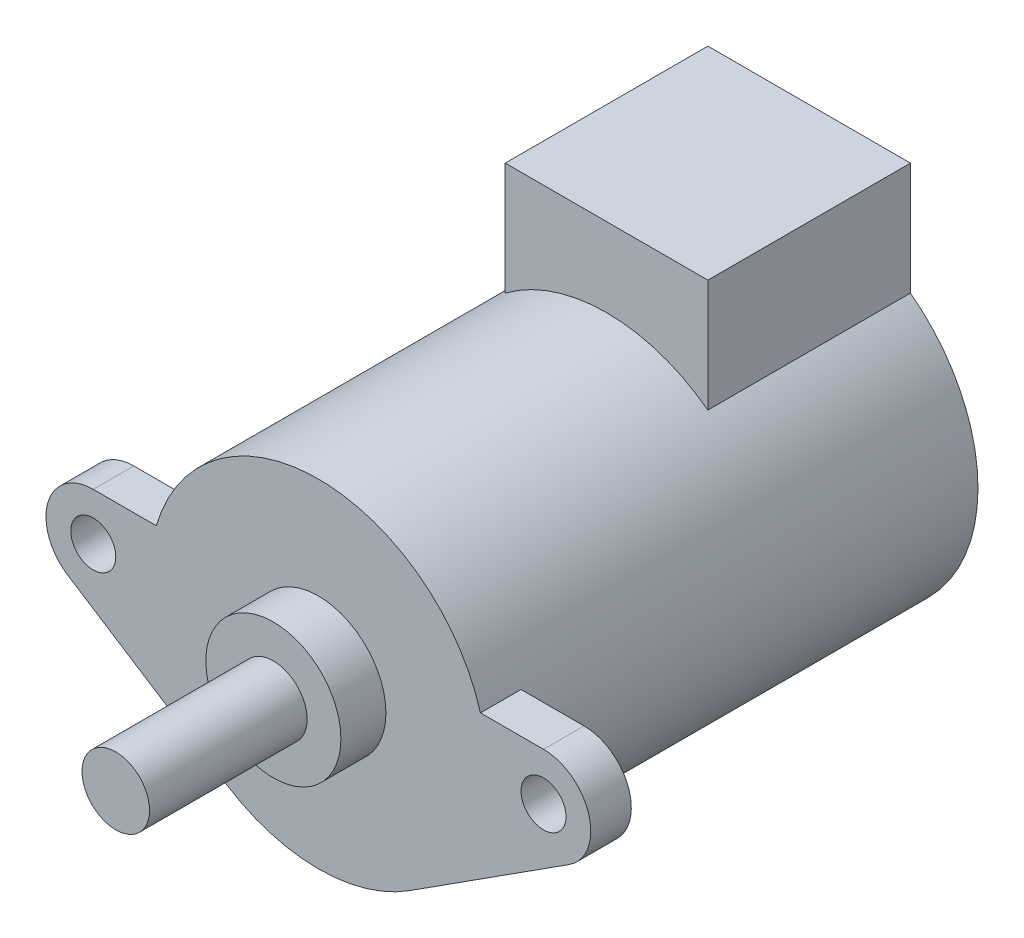
ISO-10303-21;
HEADER;
FILE_DESCRIPTION(('STEP AP214'),'2;1');
FILE_NAME('part.step','',(''),(''),'','','');
FILE_SCHEMA(('AUTOMOTIVE_DESIGN { 1 0 10303 214 1 1 1 1 }'));
ENDSEC;
DATA;
#1=APPLICATION_CONTEXT('core data for automotive mechanical design processes');
#2=APPLICATION_PROTOCOL_DEFINITION('international standard','automotive_design',2000,#1);
#3=PRODUCT_CONTEXT('',#1,'mechanical');
#4=PRODUCT('Part','Part','',(#3));
#5=PRODUCT_RELATED_PRODUCT_CATEGORY('part','',(#4));
#6=PRODUCT_DEFINITION_FORMATION('','',#4);
#7=PRODUCT_DEFINITION_CONTEXT('part definition',#1,'design');
#8=PRODUCT_DEFINITION('design','',#6,#7);
#9=PRODUCT_DEFINITION_SHAPE('','',#8);
#10=(LENGTH_UNIT() NAMED_UNIT(*) SI_UNIT(.MILLI.,.METRE.));
#11=(NAMED_UNIT(*) PLANE_ANGLE_UNIT() SI_UNIT($,.RADIAN.));
#12=(NAMED_UNIT(*) SI_UNIT($,.STERADIAN.) SOLID_ANGLE_UNIT());
#13=UNCERTAINTY_MEASURE_WITH_UNIT(LENGTH_MEASURE(1.E-05),#10,'distance_accuracy_value','');
#14=(GEOMETRIC_REPRESENTATION_CONTEXT(3) GLOBAL_UNCERTAINTY_ASSIGNED_CONTEXT((#13)) GLOBAL_UNIT_ASSIGNED_CONTEXT((#10,
#11,#12)) REPRESENTATION_CONTEXT('',''));
#15=CARTESIAN_POINT('',(0.,0.,0.));
#16=DIRECTION('',(0.,0.,1.));
#17=DIRECTION('',(1.,0.,0.));
#18=AXIS2_PLACEMENT_3D('',#15,#16,#17);
#19=CARTESIAN_POINT('',(7.5,0.,-20.));
#20=DIRECTION('',(0.,0.,-1.));
#21=DIRECTION('',(-1.,0.,0.));
#22=AXIS2_PLACEMENT_3D('',#19,#20,#21);
#23=PLANE('',#22);
#24=CARTESIAN_POINT('',(0.,0.,-20.));
#25=DIRECTION('',(0.,0.,1.));
#26=DIRECTION('',(1.,0.,0.));
#27=AXIS2_PLACEMENT_3D('',#24,#25,#26);
#28=CIRCLE('',#27,7.5);
#29=CARTESIAN_POINT('',(-4.5,5.99999999997181,-20.));
#30=VERTEX_POINT('',#29);
#31=CARTESIAN_POINT('',(4.5,6.,-20.));
#32=VERTEX_POINT('',#31);
#33=EDGE_CURVE('E11',#30,#32,#28,.T.);
#34=ORIENTED_EDGE('',*,*,#33,.F.);
#35=DIRECTION('',(0.,1.,0.));
#36=VECTOR('',#35,1.);
#37=CARTESIAN_POINT('',(-4.5,-500000.,-20.));
#38=LINE('',#37,#36);
#39=CARTESIAN_POINT('',(-4.5,11.,-20.));
#40=VERTEX_POINT('',#39);
#41=EDGE_CURVE('E122',#30,#40,#38,.T.);
#42=ORIENTED_EDGE('',*,*,#41,.T.);
#43=DIRECTION('',(-1.,0.,0.));
#44=VECTOR('',#43,1.);
#45=CARTESIAN_POINT('',(4.5,11.,-20.));
#46=LINE('',#45,#44);
#47=CARTESIAN_POINT('',(4.5,11.,-20.));
#48=VERTEX_POINT('',#47);
#49=EDGE_CURVE('E283',#48,#40,#46,.T.);
#50=ORIENTED_EDGE('',*,*,#49,.F.);
#51=DIRECTION('',(0.,1.,0.));
#52=VECTOR('',#51,1.);
#53=CARTESIAN_POINT('',(4.5,-500000.,-20.));
#54=LINE('',#53,#52);
#55=EDGE_CURVE('E124',#32,#48,#54,.T.);
#56=ORIENTED_EDGE('',*,*,#55,.F.);
#57=EDGE_LOOP('',(#34,#42,#50,#56));
#58=FACE_BOUND('',#57,.T.);
#59=CARTESIAN_POINT('',(0.,0.,-20.));
#60=DIRECTION('',(0.,0.,-1.));
#61=DIRECTION('',(-1.,0.,0.));
#62=AXIS2_PLACEMENT_3D('',#59,#60,#61);
#63=CIRCLE('',#62,1.);
#64=CARTESIAN_POINT('',(-1.,0.,-20.));
#65=VERTEX_POINT('',#64);
#66=EDGE_CURVE('E268',#65,#65,#63,.T.);
#67=ORIENTED_EDGE('',*,*,#66,.F.);
#68=EDGE_LOOP('',(#67));
#69=FACE_BOUND('',#68,.T.);
#70=ADVANCED_FACE('F33',(#58,#69),#23,.T.);
#71=CARTESIAN_POINT('',(0.,0.,3.8));
#72=DIRECTION('',(0.,0.,1.));
#73=DIRECTION('',(1.,0.,0.));
#74=AXIS2_PLACEMENT_3D('',#71,#72,#73);
#75=PLANE('',#74);
#76=CARTESIAN_POINT('',(0.,0.,3.8));
#77=DIRECTION('',(0.,0.,1.));
#78=DIRECTION('',(1.,0.,0.));
#79=AXIS2_PLACEMENT_3D('',#76,#77,#78);
#80=CIRCLE('',#79,3.);
#81=CARTESIAN_POINT('',(3.,0.,3.8));
#82=VERTEX_POINT('',#81);
#83=EDGE_CURVE('E152',#82,#82,#80,.T.);
#84=ORIENTED_EDGE('',*,*,#83,.T.);
#85=EDGE_LOOP('',(#84));
#86=FACE_BOUND('',#85,.T.);
#87=CARTESIAN_POINT('',(0.,0.,3.8));
#88=DIRECTION('',(0.,0.,1.));
#89=DIRECTION('',(1.,0.,0.));
#90=AXIS2_PLACEMENT_3D('',#87,#88,#89);
#91=CIRCLE('',#90,1.5);
#92=CARTESIAN_POINT('',(1.5,0.,3.8));
#93=VERTEX_POINT('',#92);
#94=EDGE_CURVE('E148',#93,#93,#91,.T.);
#95=ORIENTED_EDGE('',*,*,#94,.F.);
#96=EDGE_LOOP('',(#95));
#97=FACE_BOUND('',#96,.T.);
#98=ADVANCED_FACE('F250',(#86,#97),#75,.T.);
#99=CARTESIAN_POINT('',(0.,0.,1.8));
#100=DIRECTION('',(0.,0.,1.));
#101=DIRECTION('',(1.,0.,0.));
#102=AXIS2_PLACEMENT_3D('',#99,#100,#101);
#103=PLANE('',#102);
#104=CARTESIAN_POINT('',(-10.,0.,1.8));
#105=DIRECTION('',(0.,0.,1.));
#106=DIRECTION('',(1.,0.,0.));
#107=AXIS2_PLACEMENT_3D('',#104,#105,#106);
#108=CIRCLE('',#107,1.00000000000001);
#109=CARTESIAN_POINT('',(-8.99999999999999,0.,1.8));
#110=VERTEX_POINT('',#109);
#111=EDGE_CURVE('E263',#110,#110,#108,.T.);
#112=ORIENTED_EDGE('',*,*,#111,.F.);
#113=EDGE_LOOP('',(#112));
#114=FACE_BOUND('',#113,.T.);
#115=CARTESIAN_POINT('',(10.,0.,1.8));
#116=DIRECTION('',(0.,0.,1.));
#117=DIRECTION('',(1.,0.,0.));
#118=AXIS2_PLACEMENT_3D('',#115,#116,#117);
#119=CIRCLE('',#118,1.00000000000001);
#120=CARTESIAN_POINT('',(11.,0.,1.8));
#121=VERTEX_POINT('',#120);
#122=EDGE_CURVE('E266',#121,#121,#119,.T.);
#123=ORIENTED_EDGE('',*,*,#122,.F.);
#124=EDGE_LOOP('',(#123));
#125=FACE_BOUND('',#124,.T.);
#126=CARTESIAN_POINT('',(0.,0.,1.8));
#127=DIRECTION('',(0.,0.,1.));
#128=DIRECTION('',(1.,0.,0.));
#129=AXIS2_PLACEMENT_3D('',#126,#127,#128);
#130=CIRCLE('',#129,7.5);
#131=CARTESIAN_POINT('',(-4.04999999999986,-6.31248762375017,1.8));
#132=VERTEX_POINT('',#131);
#133=CARTESIAN_POINT('',(4.05000000000006,-6.31248762375009,1.8));
#134=VERTEX_POINT('',#133);
#135=EDGE_CURVE('E41',#132,#134,#130,.T.);
#136=ORIENTED_EDGE('',*,*,#135,.T.);
#137=DIRECTION('',(0.841665016500016,0.540000000000025,0.));
#138=VECTOR('',#137,1.);
#139=CARTESIAN_POINT('',(4.05000000000006,-6.31248762375009,1.8));
#140=LINE('',#139,#138);
#141=CARTESIAN_POINT('',(11.1339999999998,-1.76749653464975,1.8));
#142=VERTEX_POINT('',#141);
#143=EDGE_CURVE('E162',#134,#142,#140,.T.);
#144=ORIENTED_EDGE('',*,*,#143,.T.);
#145=CARTESIAN_POINT('',(10.,0.,1.8));
#146=DIRECTION('',(0.,0.,1.));
#147=DIRECTION('',(1.,0.,0.));
#148=AXIS2_PLACEMENT_3D('',#145,#146,#147);
#149=CIRCLE('',#148,2.09999999999982);
#150=CARTESIAN_POINT('',(10.,2.1,1.8));
#151=VERTEX_POINT('',#150);
#152=EDGE_CURVE('E155',#142,#151,#149,.T.);
#153=ORIENTED_EDGE('',*,*,#152,.T.);
#154=DIRECTION('',(-1.,0.,0.));
#155=VECTOR('',#154,1.);
#156=CARTESIAN_POINT('',(10.,2.1,1.8));
#157=LINE('',#156,#155);
#158=CARTESIAN_POINT('',(7.2,2.1,1.8));
#159=VERTEX_POINT('',#158);
#160=EDGE_CURVE('E174',#151,#159,#157,.T.);
#161=ORIENTED_EDGE('',*,*,#160,.T.);
#162=CARTESIAN_POINT('',(-7.2,2.1,1.8));
#163=VERTEX_POINT('',#162);
#164=EDGE_CURVE('E210',#159,#163,#130,.T.);
#165=ORIENTED_EDGE('',*,*,#164,.T.);
#166=DIRECTION('',(-1.,0.,0.));
#167=VECTOR('',#166,1.);
#168=CARTESIAN_POINT('',(-7.2,2.1,1.8));
#169=LINE('',#168,#167);
#170=CARTESIAN_POINT('',(-10.,2.1,1.8));
#171=VERTEX_POINT('',#170);
#172=EDGE_CURVE('E192',#163,#171,#169,.T.);
#173=ORIENTED_EDGE('',*,*,#172,.T.);
#174=CARTESIAN_POINT('',(-10.,0.,1.8));
#175=DIRECTION('',(0.,0.,1.));
#176=DIRECTION('',(1.,0.,0.));
#177=AXIS2_PLACEMENT_3D('',#174,#175,#176);
#178=CIRCLE('',#177,2.09999999999997);
#179=CARTESIAN_POINT('',(-11.134,-1.76749653465003,1.8));
#180=VERTEX_POINT('',#179);
#181=EDGE_CURVE('E180',#171,#180,#178,.T.);
#182=ORIENTED_EDGE('',*,*,#181,.T.);
#183=DIRECTION('',(0.841665016500038,-0.539999999999991,0.));
#184=VECTOR('',#183,1.);
#185=CARTESIAN_POINT('',(-11.134,-1.76749653465003,1.8));
#186=LINE('',#185,#184);
#187=EDGE_CURVE('E204',#180,#132,#186,.T.);
#188=ORIENTED_EDGE('',*,*,#187,.T.);
#189=EDGE_LOOP('',(#136,#144,#153,#161,#165,#173,#182,#188));
#190=FACE_BOUND('',#189,.T.);
#191=CARTESIAN_POINT('',(0.,0.,1.8));
#192=DIRECTION('',(0.,0.,1.));
#193=DIRECTION('',(1.,0.,0.));
#194=AXIS2_PLACEMENT_3D('',#191,#192,#193);
#195=CIRCLE('',#194,3.);
#196=CARTESIAN_POINT('',(3.,0.,1.8));
#197=VERTEX_POINT('',#196);
#198=EDGE_CURVE('E147',#197,#197,#195,.T.);
#199=ORIENTED_EDGE('',*,*,#198,.F.);
#200=EDGE_LOOP('',(#199));
#201=FACE_BOUND('',#200,.T.);
#202=ADVANCED_FACE('F222',(#114,#125,#190,#201),#103,.T.);
#203=CARTESIAN_POINT('',(0.,0.,-20.));
#204=DIRECTION('',(0.,0.,1.));
#205=DIRECTION('',(1.,0.,0.));
#206=AXIS2_PLACEMENT_3D('',#203,#204,#205);
#207=CYLINDRICAL_SURFACE('',#206,7.5);
#208=DIRECTION('',(0.,0.,1.));
#209=VECTOR('',#208,1.);
#210=CARTESIAN_POINT('',(4.5,6.,-20.));
#211=LINE('',#210,#209);
#212=CARTESIAN_POINT('',(4.50000000001353,5.99999999998985,-11.));
#213=VERTEX_POINT('',#212);
#214=EDGE_CURVE('E47',#32,#213,#211,.T.);
#215=ORIENTED_EDGE('',*,*,#214,.T.);
#216=CARTESIAN_POINT('',(0.,0.,-11.));
#217=DIRECTION('',(0.,0.,1.));
#218=DIRECTION('',(1.,0.,0.));
#219=AXIS2_PLACEMENT_3D('',#216,#217,#218);
#220=CIRCLE('',#219,7.5);
#221=CARTESIAN_POINT('',(-4.5,6.,-11.));
#222=VERTEX_POINT('',#221);
#223=EDGE_CURVE('E51',#213,#222,#220,.T.);
#224=ORIENTED_EDGE('',*,*,#223,.T.);
#225=DIRECTION('',(0.,0.,1.));
#226=VECTOR('',#225,1.);
#227=CARTESIAN_POINT('',(-4.5,6.,-20.));
#228=LINE('',#227,#226);
#229=EDGE_CURVE('E125',#222,#30,#228,.F.);
#230=ORIENTED_EDGE('',*,*,#229,.T.);
#231=ORIENTED_EDGE('',*,*,#33,.T.);
#232=EDGE_LOOP('',(#215,#224,#230,#231));
#233=FACE_BOUND('',#232,.T.);
#234=DIRECTION('',(0.,0.,1.));
#235=VECTOR('',#234,1.);
#236=CARTESIAN_POINT('',(4.05000000000006,-6.31248762375009,0.));
#237=LINE('',#236,#235);
#238=CARTESIAN_POINT('',(4.05000000000006,-6.31248762375009,0.));
#239=VERTEX_POINT('',#238);
#240=EDGE_CURVE('E181',#239,#134,#237,.T.);
#241=ORIENTED_EDGE('',*,*,#240,.T.);
#242=ORIENTED_EDGE('',*,*,#135,.F.);
#243=DIRECTION('',(0.,0.,1.));
#244=VECTOR('',#243,1.);
#245=CARTESIAN_POINT('',(-4.04999999999993,-6.3124876237502,0.));
#246=LINE('',#245,#244);
#247=CARTESIAN_POINT('',(-4.04999999999993,-6.3124876237502,0.));
#248=VERTEX_POINT('',#247);
#249=EDGE_CURVE('E214',#248,#132,#246,.T.);
#250=ORIENTED_EDGE('',*,*,#249,.F.);
#251=CARTESIAN_POINT('',(0.,0.,0.));
#252=DIRECTION('',(0.,0.,-1.));
#253=DIRECTION('',(-1.,0.,0.));
#254=AXIS2_PLACEMENT_3D('',#251,#252,#253);
#255=CIRCLE('',#254,7.49999999999993);
#256=CARTESIAN_POINT('',(-7.2,2.1,0.));
#257=VERTEX_POINT('',#256);
#258=EDGE_CURVE('E195',#248,#257,#255,.T.);
#259=ORIENTED_EDGE('',*,*,#258,.T.);
#260=DIRECTION('',(0.,0.,1.));
#261=VECTOR('',#260,1.);
#262=CARTESIAN_POINT('',(-7.2,2.1,0.));
#263=LINE('',#262,#261);
#264=EDGE_CURVE('E211',#257,#163,#263,.T.);
#265=ORIENTED_EDGE('',*,*,#264,.T.);
#266=ORIENTED_EDGE('',*,*,#164,.F.);
#267=DIRECTION('',(0.,0.,1.));
#268=VECTOR('',#267,1.);
#269=CARTESIAN_POINT('',(7.19999999999995,2.09999999999998,0.));
#270=LINE('',#269,#268);
#271=CARTESIAN_POINT('',(7.19999999999995,2.09999999999998,0.));
#272=VERTEX_POINT('',#271);
#273=EDGE_CURVE('E184',#272,#159,#270,.T.);
#274=ORIENTED_EDGE('',*,*,#273,.F.);
#275=CARTESIAN_POINT('',(0.,0.,0.));
#276=DIRECTION('',(0.,0.,-1.));
#277=DIRECTION('',(-1.,0.,0.));
#278=AXIS2_PLACEMENT_3D('',#275,#276,#277);
#279=CIRCLE('',#278,7.49999999999995);
#280=EDGE_CURVE('E165',#272,#239,#279,.T.);
#281=ORIENTED_EDGE('',*,*,#280,.T.);
#282=EDGE_LOOP('',(#241,#242,#250,#259,#265,#266,#274,#281));
#283=FACE_BOUND('',#282,.T.);
#284=ADVANCED_FACE('F35',(#233,#283),#207,.T.);
#285=CARTESIAN_POINT('',(-10.,0.,0.));
#286=DIRECTION('',(0.,0.,1.));
#287=DIRECTION('',(1.,0.,0.));
#288=AXIS2_PLACEMENT_3D('',#285,#286,#287);
#289=CYLINDRICAL_SURFACE('',#288,2.09999999999997);
#290=ORIENTED_EDGE('',*,*,#181,.F.);
#291=DIRECTION('',(0.,0.,1.));
#292=VECTOR('',#291,1.);
#293=CARTESIAN_POINT('',(-10.,2.1,0.));
#294=LINE('',#293,#292);
#295=CARTESIAN_POINT('',(-10.,2.1,0.));
#296=VERTEX_POINT('',#295);
#297=EDGE_CURVE('E208',#296,#171,#294,.T.);
#298=ORIENTED_EDGE('',*,*,#297,.F.);
#299=CARTESIAN_POINT('',(-10.,0.,0.));
#300=DIRECTION('',(0.,0.,1.));
#301=DIRECTION('',(1.,0.,0.));
#302=AXIS2_PLACEMENT_3D('',#299,#300,#301);
#303=CIRCLE('',#302,2.09999999999997);
#304=CARTESIAN_POINT('',(-11.134,-1.76749653465003,0.));
#305=VERTEX_POINT('',#304);
#306=EDGE_CURVE('E188',#296,#305,#303,.T.);
#307=ORIENTED_EDGE('',*,*,#306,.T.);
#308=DIRECTION('',(0.,0.,1.));
#309=VECTOR('',#308,1.);
#310=CARTESIAN_POINT('',(-11.134,-1.76749653465003,0.));
#311=LINE('',#310,#309);
#312=EDGE_CURVE('E201',#305,#180,#311,.T.);
#313=ORIENTED_EDGE('',*,*,#312,.T.);
#314=EDGE_LOOP('',(#290,#298,#307,#313));
#315=FACE_BOUND('',#314,.T.);
#316=ADVANCED_FACE('F239',(#315),#289,.T.);
#317=CARTESIAN_POINT('',(-7.2,2.1,0.));
#318=DIRECTION('',(0.,1.,0.));
#319=DIRECTION('',(-1.,0.,0.));
#320=AXIS2_PLACEMENT_3D('',#317,#318,#319);
#321=PLANE('',#320);
#322=ORIENTED_EDGE('',*,*,#172,.F.);
#323=ORIENTED_EDGE('',*,*,#264,.F.);
#324=DIRECTION('',(-1.,0.,0.));
#325=VECTOR('',#324,1.);
#326=CARTESIAN_POINT('',(-7.2,2.1,0.));
#327=LINE('',#326,#325);
#328=EDGE_CURVE('E198',#257,#296,#327,.T.);
#329=ORIENTED_EDGE('',*,*,#328,.T.);
#330=ORIENTED_EDGE('',*,*,#297,.T.);
#331=EDGE_LOOP('',(#322,#323,#329,#330));
#332=FACE_BOUND('',#331,.T.);
#333=ADVANCED_FACE('F227',(#332),#321,.T.);
#334=CARTESIAN_POINT('',(-11.134,-1.76749653465003,0.));
#335=DIRECTION('',(-0.539999999999991,-0.841665016500038,0.));
#336=DIRECTION('',(0.841665016500038,-0.539999999999991,0.));
#337=AXIS2_PLACEMENT_3D('',#334,#335,#336);
#338=PLANE('',#337);
#339=ORIENTED_EDGE('',*,*,#187,.F.);
#340=ORIENTED_EDGE('',*,*,#312,.F.);
#341=DIRECTION('',(0.841665016500038,-0.539999999999991,0.));
#342=VECTOR('',#341,1.);
#343=CARTESIAN_POINT('',(-11.134,-1.76749653465003,0.));
#344=LINE('',#343,#342);
#345=EDGE_CURVE('E191',#305,#248,#344,.T.);
#346=ORIENTED_EDGE('',*,*,#345,.T.);
#347=ORIENTED_EDGE('',*,*,#249,.T.);
#348=EDGE_LOOP('',(#339,#340,#346,#347));
#349=FACE_BOUND('',#348,.T.);
#350=ADVANCED_FACE('F237',(#349),#338,.T.);
#351=CARTESIAN_POINT('',(-10.,0.,0.));
#352=DIRECTION('',(0.,0.,1.));
#353=DIRECTION('',(1.,0.,0.));
#354=AXIS2_PLACEMENT_3D('',#351,#352,#353);
#355=PLANE('',#354);
#356=CARTESIAN_POINT('',(-10.,0.,0.));
#357=DIRECTION('',(0.,0.,-1.));
#358=DIRECTION('',(-1.,0.,0.));
#359=AXIS2_PLACEMENT_3D('',#356,#357,#358);
#360=CIRCLE('',#359,1.00000000000001);
#361=CARTESIAN_POINT('',(-11.,0.,0.));
#362=VERTEX_POINT('',#361);
#363=EDGE_CURVE('E448',#362,#362,#360,.T.);
#364=ORIENTED_EDGE('',*,*,#363,.F.);
#365=EDGE_LOOP('',(#364));
#366=FACE_BOUND('',#365,.T.);
#367=ORIENTED_EDGE('',*,*,#306,.F.);
#368=ORIENTED_EDGE('',*,*,#328,.F.);
#369=ORIENTED_EDGE('',*,*,#258,.F.);
#370=ORIENTED_EDGE('',*,*,#345,.F.);
#371=EDGE_LOOP('',(#367,#368,#369,#370));
#372=FACE_BOUND('',#371,.T.);
#373=ADVANCED_FACE('F234',(#366,#372),#355,.F.);
#374=CARTESIAN_POINT('',(10.,0.,0.));
#375=DIRECTION('',(0.,0.,1.));
#376=DIRECTION('',(1.,0.,0.));
#377=AXIS2_PLACEMENT_3D('',#374,#375,#376);
#378=CYLINDRICAL_SURFACE('',#377,2.09999999999982);
#379=ORIENTED_EDGE('',*,*,#152,.F.);
#380=DIRECTION('',(0.,0.,1.));
#381=VECTOR('',#380,1.);
#382=CARTESIAN_POINT('',(11.1339999999998,-1.76749653464975,0.));
#383=LINE('',#382,#381);
#384=CARTESIAN_POINT('',(11.1339999999998,-1.76749653464975,0.));
#385=VERTEX_POINT('',#384);
#386=EDGE_CURVE('E178',#385,#142,#383,.T.);
#387=ORIENTED_EDGE('',*,*,#386,.F.);
#388=CARTESIAN_POINT('',(10.,0.,0.));
#389=DIRECTION('',(0.,0.,1.));
#390=DIRECTION('',(1.,0.,0.));
#391=AXIS2_PLACEMENT_3D('',#388,#389,#390);
#392=CIRCLE('',#391,2.09999999999982);
#393=CARTESIAN_POINT('',(10.,2.1,0.));
#394=VERTEX_POINT('',#393);
#395=EDGE_CURVE('E158',#385,#394,#392,.T.);
#396=ORIENTED_EDGE('',*,*,#395,.T.);
#397=DIRECTION('',(0.,0.,1.));
#398=VECTOR('',#397,1.);
#399=CARTESIAN_POINT('',(10.,2.1,0.));
#400=LINE('',#399,#398);
#401=EDGE_CURVE('E171',#394,#151,#400,.T.);
#402=ORIENTED_EDGE('',*,*,#401,.T.);
#403=EDGE_LOOP('',(#379,#387,#396,#402));
#404=FACE_BOUND('',#403,.T.);
#405=ADVANCED_FACE('F329',(#404),#378,.T.);
#406=CARTESIAN_POINT('',(4.05000000000006,-6.31248762375009,0.));
#407=DIRECTION('',(0.540000000000025,-0.841665016500016,0.));
#408=DIRECTION('',(0.841665016500016,0.540000000000025,0.));
#409=AXIS2_PLACEMENT_3D('',#406,#407,#408);
#410=PLANE('',#409);
#411=ORIENTED_EDGE('',*,*,#143,.F.);
#412=ORIENTED_EDGE('',*,*,#240,.F.);
#413=DIRECTION('',(0.841665016500016,0.540000000000025,0.));
#414=VECTOR('',#413,1.);
#415=CARTESIAN_POINT('',(4.05000000000006,-6.31248762375009,0.));
#416=LINE('',#415,#414);
#417=EDGE_CURVE('E168',#239,#385,#416,.T.);
#418=ORIENTED_EDGE('',*,*,#417,.T.);
#419=ORIENTED_EDGE('',*,*,#386,.T.);
#420=EDGE_LOOP('',(#411,#412,#418,#419));
#421=FACE_BOUND('',#420,.T.);
#422=ADVANCED_FACE('F326',(#421),#410,.T.);
#423=CARTESIAN_POINT('',(10.,2.1,0.));
#424=DIRECTION('',(0.,1.,0.));
#425=DIRECTION('',(-1.,0.,0.));
#426=AXIS2_PLACEMENT_3D('',#423,#424,#425);
#427=PLANE('',#426);
#428=ORIENTED_EDGE('',*,*,#160,.F.);
#429=ORIENTED_EDGE('',*,*,#401,.F.);
#430=DIRECTION('',(-1.,0.,0.));
#431=VECTOR('',#430,1.);
#432=CARTESIAN_POINT('',(10.,2.1,0.));
#433=LINE('',#432,#431);
#434=EDGE_CURVE('E161',#394,#272,#433,.T.);
#435=ORIENTED_EDGE('',*,*,#434,.T.);
#436=ORIENTED_EDGE('',*,*,#273,.T.);
#437=EDGE_LOOP('',(#428,#429,#435,#436));
#438=FACE_BOUND('',#437,.T.);
#439=ADVANCED_FACE('F324',(#438),#427,.T.);
#440=CARTESIAN_POINT('',(10.,0.,0.));
#441=DIRECTION('',(0.,0.,1.));
#442=DIRECTION('',(1.,0.,0.));
#443=AXIS2_PLACEMENT_3D('',#440,#441,#442);
#444=PLANE('',#443);
#445=CARTESIAN_POINT('',(10.,0.,0.));
#446=DIRECTION('',(0.,0.,-1.));
#447=DIRECTION('',(-1.,0.,0.));
#448=AXIS2_PLACEMENT_3D('',#445,#446,#447);
#449=CIRCLE('',#448,1.00000000000001);
#450=CARTESIAN_POINT('',(8.99999999999999,0.,0.));
#451=VERTEX_POINT('',#450);
#452=EDGE_CURVE('E269',#451,#451,#449,.T.);
#453=ORIENTED_EDGE('',*,*,#452,.F.);
#454=EDGE_LOOP('',(#453));
#455=FACE_BOUND('',#454,.T.);
#456=ORIENTED_EDGE('',*,*,#395,.F.);
#457=ORIENTED_EDGE('',*,*,#417,.F.);
#458=ORIENTED_EDGE('',*,*,#280,.F.);
#459=ORIENTED_EDGE('',*,*,#434,.F.);
#460=EDGE_LOOP('',(#456,#457,#458,#459));
#461=FACE_BOUND('',#460,.T.);
#462=ADVANCED_FACE('F320',(#455,#461),#444,.F.);
#463=CARTESIAN_POINT('',(0.,0.,3.8));
#464=DIRECTION('',(0.,0.,-1.));
#465=DIRECTION('',(-1.,0.,0.));
#466=AXIS2_PLACEMENT_3D('',#463,#464,#465);
#467=CYLINDRICAL_SURFACE('',#466,3.);
#468=ORIENTED_EDGE('',*,*,#83,.F.);
#469=EDGE_LOOP('',(#468));
#470=FACE_BOUND('',#469,.T.);
#471=ORIENTED_EDGE('',*,*,#198,.T.);
#472=EDGE_LOOP('',(#471));
#473=FACE_BOUND('',#472,.T.);
#474=ADVANCED_FACE('F315',(#470,#473),#467,.T.);
#475=CARTESIAN_POINT('',(0.,0.,10.8));
#476=DIRECTION('',(0.,0.,-1.));
#477=DIRECTION('',(-1.,0.,0.));
#478=AXIS2_PLACEMENT_3D('',#475,#476,#477);
#479=CYLINDRICAL_SURFACE('',#478,1.5);
#480=CARTESIAN_POINT('',(0.,0.,10.8));
#481=DIRECTION('',(0.,0.,1.));
#482=DIRECTION('',(1.,0.,0.));
#483=AXIS2_PLACEMENT_3D('',#480,#481,#482);
#484=CIRCLE('',#483,1.5);
#485=CARTESIAN_POINT('',(1.5,0.,10.8));
#486=VERTEX_POINT('',#485);
#487=EDGE_CURVE('E144',#486,#486,#484,.T.);
#488=ORIENTED_EDGE('',*,*,#487,.F.);
#489=EDGE_LOOP('',(#488));
#490=FACE_BOUND('',#489,.T.);
#491=ORIENTED_EDGE('',*,*,#94,.T.);
#492=EDGE_LOOP('',(#491));
#493=FACE_BOUND('',#492,.T.);
#494=ADVANCED_FACE('F312',(#490,#493),#479,.T.);
#495=CARTESIAN_POINT('',(0.,0.,10.8));
#496=DIRECTION('',(0.,0.,1.));
#497=DIRECTION('',(1.,0.,0.));
#498=AXIS2_PLACEMENT_3D('',#495,#496,#497);
#499=PLANE('',#498);
#500=ORIENTED_EDGE('',*,*,#487,.T.);
#501=EDGE_LOOP('',(#500));
#502=FACE_BOUND('',#501,.T.);
#503=ADVANCED_FACE('F302',(#502),#499,.T.);
#504=CARTESIAN_POINT('',(4.5,-500000.,-11.));
#505=DIRECTION('',(1.,0.,0.));
#506=DIRECTION('',(0.,0.,-1.));
#507=AXIS2_PLACEMENT_3D('',#504,#505,#506);
#508=PLANE('',#507);
#509=ORIENTED_EDGE('',*,*,#214,.F.);
#510=ORIENTED_EDGE('',*,*,#55,.T.);
#511=DIRECTION('',(0.,0.,-1.));
#512=VECTOR('',#511,1.);
#513=CARTESIAN_POINT('',(4.5,11.,-11.));
#514=LINE('',#513,#512);
#515=CARTESIAN_POINT('',(4.5,11.,-11.));
#516=VERTEX_POINT('',#515);
#517=EDGE_CURVE('E281',#516,#48,#514,.T.);
#518=ORIENTED_EDGE('',*,*,#517,.F.);
#519=DIRECTION('',(0.,1.,0.));
#520=VECTOR('',#519,1.);
#521=CARTESIAN_POINT('',(4.5,-500000.,-11.));
#522=LINE('',#521,#520);
#523=EDGE_CURVE('E138',#213,#516,#522,.T.);
#524=ORIENTED_EDGE('',*,*,#523,.F.);
#525=EDGE_LOOP('',(#509,#510,#518,#524));
#526=FACE_BOUND('',#525,.T.);
#527=ADVANCED_FACE('F292',(#526),#508,.T.);
#528=CARTESIAN_POINT('',(4.5,11.,-11.));
#529=DIRECTION('',(0.,1.,0.));
#530=DIRECTION('',(0.,0.,1.));
#531=AXIS2_PLACEMENT_3D('',#528,#529,#530);
#532=PLANE('',#531);
#533=DIRECTION('',(1.,0.,0.));
#534=VECTOR('',#533,1.);
#535=CARTESIAN_POINT('',(-4.5,11.,-11.));
#536=LINE('',#535,#534);
#537=CARTESIAN_POINT('',(-4.5,11.,-11.));
#538=VERTEX_POINT('',#537);
#539=EDGE_CURVE('E151',#538,#516,#536,.T.);
#540=ORIENTED_EDGE('',*,*,#539,.T.);
#541=ORIENTED_EDGE('',*,*,#517,.T.);
#542=ORIENTED_EDGE('',*,*,#49,.T.);
#543=DIRECTION('',(0.,0.,1.));
#544=VECTOR('',#543,1.);
#545=CARTESIAN_POINT('',(-4.5,11.,-20.));
#546=LINE('',#545,#544);
#547=EDGE_CURVE('E133',#40,#538,#546,.T.);
#548=ORIENTED_EDGE('',*,*,#547,.T.);
#549=EDGE_LOOP('',(#540,#541,#542,#548));
#550=FACE_BOUND('',#549,.T.);
#551=ADVANCED_FACE('F294',(#550),#532,.T.);
#552=CARTESIAN_POINT('',(-4.5,-500000.,-11.));
#553=DIRECTION('',(0.,0.,1.));
#554=DIRECTION('',(1.,0.,0.));
#555=AXIS2_PLACEMENT_3D('',#552,#553,#554);
#556=PLANE('',#555);
#557=ORIENTED_EDGE('',*,*,#223,.F.);
#558=ORIENTED_EDGE('',*,*,#523,.T.);
#559=ORIENTED_EDGE('',*,*,#539,.F.);
#560=DIRECTION('',(0.,1.,0.));
#561=VECTOR('',#560,1.);
#562=CARTESIAN_POINT('',(-4.5,-500000.,-11.));
#563=LINE('',#562,#561);
#564=EDGE_CURVE('E135',#222,#538,#563,.T.);
#565=ORIENTED_EDGE('',*,*,#564,.F.);
#566=EDGE_LOOP('',(#557,#558,#559,#565));
#567=FACE_BOUND('',#566,.T.);
#568=ADVANCED_FACE('F290',(#567),#556,.T.);
#569=CARTESIAN_POINT('',(-4.5,-500000.,-20.));
#570=DIRECTION('',(-1.,0.,0.));
#571=DIRECTION('',(0.,0.,1.));
#572=AXIS2_PLACEMENT_3D('',#569,#570,#571);
#573=PLANE('',#572);
#574=ORIENTED_EDGE('',*,*,#229,.F.);
#575=ORIENTED_EDGE('',*,*,#564,.T.);
#576=ORIENTED_EDGE('',*,*,#547,.F.);
#577=ORIENTED_EDGE('',*,*,#41,.F.);
#578=EDGE_LOOP('',(#574,#575,#576,#577));
#579=FACE_BOUND('',#578,.T.);
#580=ADVANCED_FACE('F131',(#579),#573,.T.);
#581=CARTESIAN_POINT('',(0.,0.,-21.5));
#582=DIRECTION('',(0.,0.,1.));
#583=DIRECTION('',(1.,0.,0.));
#584=AXIS2_PLACEMENT_3D('',#581,#582,#583);
#585=CYLINDRICAL_SURFACE('',#584,1.);
#586=CARTESIAN_POINT('',(0.,0.,-21.5));
#587=DIRECTION('',(0.,0.,-1.));
#588=DIRECTION('',(-1.,0.,0.));
#589=AXIS2_PLACEMENT_3D('',#586,#587,#588);
#590=CIRCLE('',#589,1.);
#591=CARTESIAN_POINT('',(-1.,0.,-21.5));
#592=VERTEX_POINT('',#591);
#593=EDGE_CURVE('E129',#592,#592,#590,.T.);
#594=ORIENTED_EDGE('',*,*,#593,.F.);
#595=EDGE_LOOP('',(#594));
#596=FACE_BOUND('',#595,.T.);
#597=ORIENTED_EDGE('',*,*,#66,.T.);
#598=EDGE_LOOP('',(#597));
#599=FACE_BOUND('',#598,.T.);
#600=ADVANCED_FACE('F304',(#596,#599),#585,.T.);
#601=CARTESIAN_POINT('',(0.,0.,-21.5));
#602=DIRECTION('',(0.,0.,-1.));
#603=DIRECTION('',(-1.,0.,0.));
#604=AXIS2_PLACEMENT_3D('',#601,#602,#603);
#605=PLANE('',#604);
#606=ORIENTED_EDGE('',*,*,#593,.T.);
#607=EDGE_LOOP('',(#606));
#608=FACE_BOUND('',#607,.T.);
#609=ADVANCED_FACE('F416',(#608),#605,.T.);
#610=CARTESIAN_POINT('',(10.,0.,0.));
#611=DIRECTION('',(0.,0.,-1.));
#612=DIRECTION('',(-1.,0.,0.));
#613=AXIS2_PLACEMENT_3D('',#610,#611,#612);
#614=CYLINDRICAL_SURFACE('',#613,1.00000000000001);
#615=ORIENTED_EDGE('',*,*,#122,.T.);
#616=EDGE_LOOP('',(#615));
#617=FACE_BOUND('',#616,.T.);
#618=ORIENTED_EDGE('',*,*,#452,.T.);
#619=EDGE_LOOP('',(#618));
#620=FACE_BOUND('',#619,.T.);
#621=ADVANCED_FACE('F424',(#617,#620),#614,.F.);
#622=CARTESIAN_POINT('',(-10.,0.,0.));
#623=DIRECTION('',(0.,0.,-1.));
#624=DIRECTION('',(-1.,0.,0.));
#625=AXIS2_PLACEMENT_3D('',#622,#623,#624);
#626=CYLINDRICAL_SURFACE('',#625,1.00000000000001);
#627=ORIENTED_EDGE('',*,*,#111,.T.);
#628=EDGE_LOOP('',(#627));
#629=FACE_BOUND('',#628,.T.);
#630=ORIENTED_EDGE('',*,*,#363,.T.);
#631=EDGE_LOOP('',(#630));
#632=FACE_BOUND('',#631,.T.);
#633=ADVANCED_FACE('F433',(#629,#632),#626,.F.);
#634=CLOSED_SHELL('',(#70,#98,#202,#284,#316,#333,#350,#373,#405,#422,#439,#462,#474,#494,#503,
#527,#551,#568,#580,#600,#609,#621,#633));
#635=MANIFOLD_SOLID_BREP('B2',#634);
#636=ADVANCED_BREP_SHAPE_REPRESENTATION('',(#18,#635),#14);
#637=SHAPE_DEFINITION_REPRESENTATION(#9,#636);
ENDSEC;
END-ISO-10303-21;
